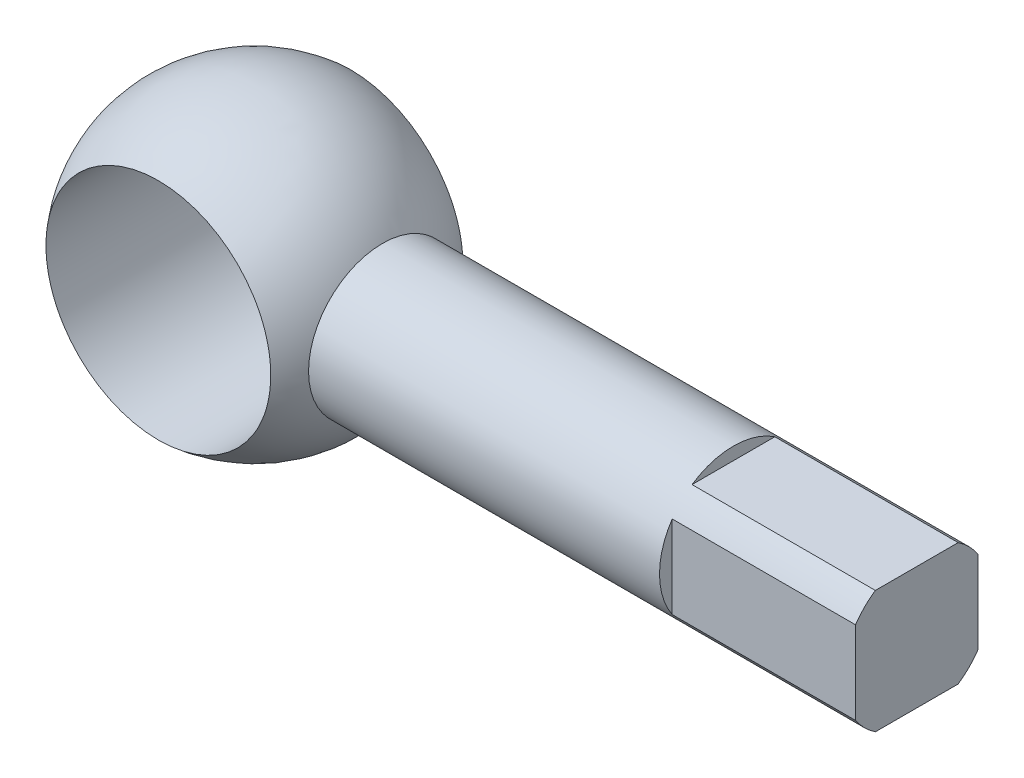
ISO-10303-21;
HEADER;
FILE_DESCRIPTION(('STEP AP214'),'2;1');
FILE_NAME('part.step','',(''),(''),'','','');
FILE_SCHEMA(('AUTOMOTIVE_DESIGN { 1 0 10303 214 1 1 1 1 }'));
ENDSEC;
DATA;
#1=APPLICATION_CONTEXT('core data for automotive mechanical design processes');
#2=APPLICATION_PROTOCOL_DEFINITION('international standard','automotive_design',2000,#1);
#3=PRODUCT_CONTEXT('',#1,'mechanical');
#4=PRODUCT('Part','Part','',(#3));
#5=PRODUCT_RELATED_PRODUCT_CATEGORY('part','',(#4));
#6=PRODUCT_DEFINITION_FORMATION('','',#4);
#7=PRODUCT_DEFINITION_CONTEXT('part definition',#1,'design');
#8=PRODUCT_DEFINITION('design','',#6,#7);
#9=PRODUCT_DEFINITION_SHAPE('','',#8);
#10=(LENGTH_UNIT() NAMED_UNIT(*) SI_UNIT(.MILLI.,.METRE.));
#11=(NAMED_UNIT(*) PLANE_ANGLE_UNIT() SI_UNIT($,.RADIAN.));
#12=(NAMED_UNIT(*) SI_UNIT($,.STERADIAN.) SOLID_ANGLE_UNIT());
#13=UNCERTAINTY_MEASURE_WITH_UNIT(LENGTH_MEASURE(1.E-05),#10,'distance_accuracy_value','');
#14=(GEOMETRIC_REPRESENTATION_CONTEXT(3) GLOBAL_UNCERTAINTY_ASSIGNED_CONTEXT((#13)) GLOBAL_UNIT_ASSIGNED_CONTEXT((#10,
#11,#12)) REPRESENTATION_CONTEXT('',''));
#15=CARTESIAN_POINT('',(0.,0.,0.));
#16=DIRECTION('',(0.,0.,1.));
#17=DIRECTION('',(1.,0.,0.));
#18=AXIS2_PLACEMENT_3D('',#15,#16,#17);
#19=CARTESIAN_POINT('',(-25.,0.,0.));
#20=DIRECTION('',(-1.,0.,0.));
#21=DIRECTION('',(0.,0.,1.));
#22=AXIS2_PLACEMENT_3D('',#19,#20,#21);
#23=CYLINDRICAL_SURFACE('',#22,12.5);
#24=CARTESIAN_POINT('',(21.650635094611,0.,0.));
#25=DIRECTION('',(-1.,0.,0.));
#26=DIRECTION('',(0.,0.,1.));
#27=AXIS2_PLACEMENT_3D('',#24,#25,#26);
#28=CIRCLE('',#27,12.5);
#29=CARTESIAN_POINT('',(21.650635094611,0.,12.5));
#30=VERTEX_POINT('',#29);
#31=EDGE_CURVE('E11',#30,#30,#28,.T.);
#32=ORIENTED_EDGE('',*,*,#31,.F.);
#33=EDGE_LOOP('',(#32));
#34=FACE_BOUND('',#33,.T.);
#35=DIRECTION('',(-1.,0.,0.));
#36=VECTOR('',#35,1.);
#37=CARTESIAN_POINT('',(411.706116100285,7.00000000000011,10.3561575886039));
#38=LINE('',#37,#36);
#39=CARTESIAN_POINT('',(112.,7.00000000000011,10.3561575886039));
#40=VERTEX_POINT('',#39);
#41=CARTESIAN_POINT('',(81.,7.0000000000001,10.3561575886039));
#42=VERTEX_POINT('',#41);
#43=EDGE_CURVE('E63',#40,#42,#38,.T.);
#44=ORIENTED_EDGE('',*,*,#43,.F.);
#45=CARTESIAN_POINT('',(112.,0.,0.));
#46=DIRECTION('',(-1.,0.,0.));
#47=DIRECTION('',(0.,0.,1.));
#48=AXIS2_PLACEMENT_3D('',#45,#46,#47);
#49=CIRCLE('',#48,12.5);
#50=CARTESIAN_POINT('',(112.,10.356157588604,7.));
#51=VERTEX_POINT('',#50);
#52=EDGE_CURVE('E131',#40,#51,#49,.T.);
#53=ORIENTED_EDGE('',*,*,#52,.T.);
#54=DIRECTION('',(-1.,0.,0.));
#55=VECTOR('',#54,1.);
#56=CARTESIAN_POINT('',(411.706116100285,10.356157588604,7.));
#57=LINE('',#56,#55);
#58=CARTESIAN_POINT('',(81.,10.356157588604,7.));
#59=VERTEX_POINT('',#58);
#60=EDGE_CURVE('E150',#51,#59,#57,.T.);
#61=ORIENTED_EDGE('',*,*,#60,.T.);
#62=CARTESIAN_POINT('',(81.,0.,0.));
#63=DIRECTION('',(-1.,0.,0.));
#64=DIRECTION('',(0.,0.,1.));
#65=AXIS2_PLACEMENT_3D('',#62,#63,#64);
#66=CIRCLE('',#65,12.5);
#67=CARTESIAN_POINT('',(81.,10.356157588604,-6.99999999999999));
#68=VERTEX_POINT('',#67);
#69=EDGE_CURVE('E145',#59,#68,#66,.T.);
#70=ORIENTED_EDGE('',*,*,#69,.T.);
#71=DIRECTION('',(-1.,0.,0.));
#72=VECTOR('',#71,1.);
#73=CARTESIAN_POINT('',(411.706116100285,10.356157588604,-7.));
#74=LINE('',#73,#72);
#75=CARTESIAN_POINT('',(112.,10.356157588604,-7.));
#76=VERTEX_POINT('',#75);
#77=EDGE_CURVE('E157',#76,#68,#74,.T.);
#78=ORIENTED_EDGE('',*,*,#77,.F.);
#79=CARTESIAN_POINT('',(112.,6.99999999999996,-10.356157588604));
#80=VERTEX_POINT('',#79);
#81=EDGE_CURVE('E55',#76,#80,#49,.T.);
#82=ORIENTED_EDGE('',*,*,#81,.T.);
#83=DIRECTION('',(-1.,0.,0.));
#84=VECTOR('',#83,1.);
#85=CARTESIAN_POINT('',(411.706116100285,6.99999999999996,-10.356157588604));
#86=LINE('',#85,#84);
#87=CARTESIAN_POINT('',(81.,6.99999999999996,-10.356157588604));
#88=VERTEX_POINT('',#87);
#89=EDGE_CURVE('E176',#80,#88,#86,.T.);
#90=ORIENTED_EDGE('',*,*,#89,.T.);
#91=CARTESIAN_POINT('',(81.,0.,0.));
#92=DIRECTION('',(-1.,0.,0.));
#93=DIRECTION('',(0.,0.,1.));
#94=AXIS2_PLACEMENT_3D('',#91,#92,#93);
#95=CIRCLE('',#94,12.5);
#96=CARTESIAN_POINT('',(81.,-7.00000000000003,-10.356157588604));
#97=VERTEX_POINT('',#96);
#98=EDGE_CURVE('E170',#88,#97,#95,.T.);
#99=ORIENTED_EDGE('',*,*,#98,.T.);
#100=DIRECTION('',(-1.,0.,0.));
#101=VECTOR('',#100,1.);
#102=CARTESIAN_POINT('',(411.706116100285,-7.00000000000004,-10.356157588604));
#103=LINE('',#102,#101);
#104=CARTESIAN_POINT('',(112.,-7.00000000000004,-10.356157588604));
#105=VERTEX_POINT('',#104);
#106=EDGE_CURVE('E180',#105,#97,#103,.T.);
#107=ORIENTED_EDGE('',*,*,#106,.F.);
#108=CARTESIAN_POINT('',(112.,-10.356157588604,-7.));
#109=VERTEX_POINT('',#108);
#110=EDGE_CURVE('E137',#105,#109,#49,.T.);
#111=ORIENTED_EDGE('',*,*,#110,.T.);
#112=DIRECTION('',(-1.,0.,0.));
#113=VECTOR('',#112,1.);
#114=CARTESIAN_POINT('',(411.706116100285,-10.356157588604,-7.));
#115=LINE('',#114,#113);
#116=CARTESIAN_POINT('',(81.,-10.356157588604,-7.));
#117=VERTEX_POINT('',#116);
#118=EDGE_CURVE('E175',#109,#117,#115,.T.);
#119=ORIENTED_EDGE('',*,*,#118,.T.);
#120=CARTESIAN_POINT('',(81.,0.,0.));
#121=DIRECTION('',(-1.,0.,0.));
#122=DIRECTION('',(0.,0.,1.));
#123=AXIS2_PLACEMENT_3D('',#120,#121,#122);
#124=CIRCLE('',#123,12.5);
#125=CARTESIAN_POINT('',(81.,-10.356157588604,6.99999999999999));
#126=VERTEX_POINT('',#125);
#127=EDGE_CURVE('E122',#117,#126,#124,.T.);
#128=ORIENTED_EDGE('',*,*,#127,.T.);
#129=DIRECTION('',(-1.,0.,0.));
#130=VECTOR('',#129,1.);
#131=CARTESIAN_POINT('',(411.706116100285,-10.356157588604,7.));
#132=LINE('',#131,#130);
#133=CARTESIAN_POINT('',(112.,-10.356157588604,7.));
#134=VERTEX_POINT('',#133);
#135=EDGE_CURVE('E71',#134,#126,#132,.T.);
#136=ORIENTED_EDGE('',*,*,#135,.F.);
#137=CARTESIAN_POINT('',(112.,-6.99999999999989,10.3561575886041));
#138=VERTEX_POINT('',#137);
#139=EDGE_CURVE('E129',#134,#138,#49,.T.);
#140=ORIENTED_EDGE('',*,*,#139,.T.);
#141=DIRECTION('',(-1.,0.,0.));
#142=VECTOR('',#141,1.);
#143=CARTESIAN_POINT('',(411.706116100285,-6.99999999999989,10.3561575886041));
#144=LINE('',#143,#142);
#145=CARTESIAN_POINT('',(81.,-6.99999999999989,10.3561575886041));
#146=VERTEX_POINT('',#145);
#147=EDGE_CURVE('E113',#138,#146,#144,.T.);
#148=ORIENTED_EDGE('',*,*,#147,.T.);
#149=CARTESIAN_POINT('',(81.,0.,0.));
#150=DIRECTION('',(-1.,0.,0.));
#151=DIRECTION('',(0.,0.,1.));
#152=AXIS2_PLACEMENT_3D('',#149,#150,#151);
#153=CIRCLE('',#152,12.5);
#154=EDGE_CURVE('E133',#146,#42,#153,.T.);
#155=ORIENTED_EDGE('',*,*,#154,.T.);
#156=EDGE_LOOP('',(#44,#53,#61,#70,#78,#82,#90,#99,#107,#111,#119,#128,#136,#140,#148,#155));
#157=FACE_BOUND('',#156,.T.);
#158=ADVANCED_FACE('F45',(#34,#157),#23,.T.);
#159=CARTESIAN_POINT('',(0.,0.,0.));
#160=DIRECTION('',(-1.,0.,0.));
#161=DIRECTION('',(0.,1.,0.));
#162=AXIS2_PLACEMENT_3D('',#159,#160,#161);
#163=SPHERICAL_SURFACE('',#162,25.);
#164=CARTESIAN_POINT('',(0.,0.,16.2480768092719));
#165=DIRECTION('',(0.,0.,-1.));
#166=DIRECTION('',(-1.,0.,0.));
#167=AXIS2_PLACEMENT_3D('',#164,#165,#166);
#168=CIRCLE('',#167,19.);
#169=CARTESIAN_POINT('',(-19.,0.,16.2480768092719));
#170=VERTEX_POINT('',#169);
#171=EDGE_CURVE('E49',#170,#170,#168,.T.);
#172=ORIENTED_EDGE('',*,*,#171,.T.);
#173=EDGE_LOOP('',(#172));
#174=FACE_BOUND('',#173,.T.);
#175=CARTESIAN_POINT('',(0.,0.,-16.2480768092719));
#176=DIRECTION('',(0.,0.,1.));
#177=DIRECTION('',(1.,0.,0.));
#178=AXIS2_PLACEMENT_3D('',#175,#176,#177);
#179=CIRCLE('',#178,19.);
#180=CARTESIAN_POINT('',(19.,0.,-16.2480768092719));
#181=VERTEX_POINT('',#180);
#182=EDGE_CURVE('E147',#181,#181,#179,.T.);
#183=ORIENTED_EDGE('',*,*,#182,.T.);
#184=EDGE_LOOP('',(#183));
#185=FACE_BOUND('',#184,.T.);
#186=ORIENTED_EDGE('',*,*,#31,.T.);
#187=EDGE_LOOP('',(#186));
#188=FACE_BOUND('',#187,.T.);
#189=ADVANCED_FACE('F47',(#174,#185,#188),#163,.T.);
#190=CARTESIAN_POINT('',(112.,12.5,0.));
#191=DIRECTION('',(-1.,0.,0.));
#192=DIRECTION('',(0.,0.,1.));
#193=AXIS2_PLACEMENT_3D('',#190,#191,#192);
#194=PLANE('',#193);
#195=ORIENTED_EDGE('',*,*,#52,.F.);
#196=DIRECTION('',(0.,-1.,0.));
#197=VECTOR('',#196,1.);
#198=CARTESIAN_POINT('',(112.,-6.99999999999989,10.3561575886041));
#199=LINE('',#198,#197);
#200=EDGE_CURVE('E116',#40,#138,#199,.T.);
#201=ORIENTED_EDGE('',*,*,#200,.T.);
#202=ORIENTED_EDGE('',*,*,#139,.F.);
#203=DIRECTION('',(0.,0.,-1.));
#204=VECTOR('',#203,1.);
#205=CARTESIAN_POINT('',(112.,-10.356157588604,-7.));
#206=LINE('',#205,#204);
#207=EDGE_CURVE('E192',#134,#109,#206,.T.);
#208=ORIENTED_EDGE('',*,*,#207,.T.);
#209=ORIENTED_EDGE('',*,*,#110,.F.);
#210=DIRECTION('',(0.,1.,0.));
#211=VECTOR('',#210,1.);
#212=CARTESIAN_POINT('',(112.,6.99999999999996,-10.356157588604));
#213=LINE('',#212,#211);
#214=EDGE_CURVE('E174',#105,#80,#213,.T.);
#215=ORIENTED_EDGE('',*,*,#214,.T.);
#216=ORIENTED_EDGE('',*,*,#81,.F.);
#217=DIRECTION('',(0.,0.,1.));
#218=VECTOR('',#217,1.);
#219=CARTESIAN_POINT('',(112.,10.356157588604,7.));
#220=LINE('',#219,#218);
#221=EDGE_CURVE('E164',#76,#51,#220,.T.);
#222=ORIENTED_EDGE('',*,*,#221,.T.);
#223=EDGE_LOOP('',(#195,#201,#202,#208,#209,#215,#216,#222));
#224=FACE_BOUND('',#223,.T.);
#225=ADVANCED_FACE('F127',(#224),#194,.F.);
#226=CARTESIAN_POINT('',(0.,0.,-25.));
#227=DIRECTION('',(0.,0.,1.));
#228=DIRECTION('',(1.,0.,0.));
#229=AXIS2_PLACEMENT_3D('',#226,#227,#228);
#230=CYLINDRICAL_SURFACE('',#229,19.);
#231=ORIENTED_EDGE('',*,*,#182,.F.);
#232=EDGE_LOOP('',(#231));
#233=FACE_BOUND('',#232,.T.);
#234=ORIENTED_EDGE('',*,*,#171,.F.);
#235=EDGE_LOOP('',(#234));
#236=FACE_BOUND('',#235,.T.);
#237=ADVANCED_FACE('F245',(#233,#236),#230,.F.);
#238=CARTESIAN_POINT('',(411.706116100285,10.356157588604,7.));
#239=DIRECTION('',(0.,1.,0.));
#240=DIRECTION('',(0.,0.,1.));
#241=AXIS2_PLACEMENT_3D('',#238,#239,#240);
#242=PLANE('',#241);
#243=ORIENTED_EDGE('',*,*,#221,.F.);
#244=ORIENTED_EDGE('',*,*,#77,.T.);
#245=DIRECTION('',(0.,0.,1.));
#246=VECTOR('',#245,1.);
#247=CARTESIAN_POINT('',(81.,10.356157588604,7.));
#248=LINE('',#247,#246);
#249=EDGE_CURVE('E161',#68,#59,#248,.T.);
#250=ORIENTED_EDGE('',*,*,#249,.T.);
#251=ORIENTED_EDGE('',*,*,#60,.F.);
#252=EDGE_LOOP('',(#243,#244,#250,#251));
#253=FACE_BOUND('',#252,.T.);
#254=ADVANCED_FACE('F215',(#253),#242,.T.);
#255=CARTESIAN_POINT('',(81.,12.5,0.));
#256=DIRECTION('',(-1.,0.,0.));
#257=DIRECTION('',(0.,0.,1.));
#258=AXIS2_PLACEMENT_3D('',#255,#256,#257);
#259=PLANE('',#258);
#260=ORIENTED_EDGE('',*,*,#69,.F.);
#261=ORIENTED_EDGE('',*,*,#249,.F.);
#262=EDGE_LOOP('',(#260,#261));
#263=FACE_BOUND('',#262,.T.);
#264=ADVANCED_FACE('F213',(#263),#259,.F.);
#265=CARTESIAN_POINT('',(411.706116100285,6.99999999999996,-10.356157588604));
#266=DIRECTION('',(0.,0.,-1.));
#267=DIRECTION('',(0.,1.,0.));
#268=AXIS2_PLACEMENT_3D('',#265,#266,#267);
#269=PLANE('',#268);
#270=ORIENTED_EDGE('',*,*,#214,.F.);
#271=ORIENTED_EDGE('',*,*,#106,.T.);
#272=DIRECTION('',(0.,1.,0.));
#273=VECTOR('',#272,1.);
#274=CARTESIAN_POINT('',(81.,6.99999999999996,-10.356157588604));
#275=LINE('',#274,#273);
#276=EDGE_CURVE('E183',#97,#88,#275,.T.);
#277=ORIENTED_EDGE('',*,*,#276,.T.);
#278=ORIENTED_EDGE('',*,*,#89,.F.);
#279=EDGE_LOOP('',(#270,#271,#277,#278));
#280=FACE_BOUND('',#279,.T.);
#281=ADVANCED_FACE('F219',(#280),#269,.T.);
#282=CARTESIAN_POINT('',(81.,12.5,0.));
#283=DIRECTION('',(-1.,0.,0.));
#284=DIRECTION('',(0.,0.,1.));
#285=AXIS2_PLACEMENT_3D('',#282,#283,#284);
#286=PLANE('',#285);
#287=ORIENTED_EDGE('',*,*,#98,.F.);
#288=ORIENTED_EDGE('',*,*,#276,.F.);
#289=EDGE_LOOP('',(#287,#288));
#290=FACE_BOUND('',#289,.T.);
#291=ADVANCED_FACE('F222',(#290),#286,.F.);
#292=CARTESIAN_POINT('',(411.706116100285,-10.356157588604,-7.));
#293=DIRECTION('',(0.,-1.,0.));
#294=DIRECTION('',(0.,0.,-1.));
#295=AXIS2_PLACEMENT_3D('',#292,#293,#294);
#296=PLANE('',#295);
#297=ORIENTED_EDGE('',*,*,#207,.F.);
#298=ORIENTED_EDGE('',*,*,#135,.T.);
#299=DIRECTION('',(0.,0.,-1.));
#300=VECTOR('',#299,1.);
#301=CARTESIAN_POINT('',(81.,-10.356157588604,-7.));
#302=LINE('',#301,#300);
#303=EDGE_CURVE('E198',#126,#117,#302,.T.);
#304=ORIENTED_EDGE('',*,*,#303,.T.);
#305=ORIENTED_EDGE('',*,*,#118,.F.);
#306=EDGE_LOOP('',(#297,#298,#304,#305));
#307=FACE_BOUND('',#306,.T.);
#308=ADVANCED_FACE('F224',(#307),#296,.T.);
#309=CARTESIAN_POINT('',(81.,12.5,0.));
#310=DIRECTION('',(-1.,0.,0.));
#311=DIRECTION('',(0.,0.,1.));
#312=AXIS2_PLACEMENT_3D('',#309,#310,#311);
#313=PLANE('',#312);
#314=ORIENTED_EDGE('',*,*,#127,.F.);
#315=ORIENTED_EDGE('',*,*,#303,.F.);
#316=EDGE_LOOP('',(#314,#315));
#317=FACE_BOUND('',#316,.T.);
#318=ADVANCED_FACE('F230',(#317),#313,.F.);
#319=CARTESIAN_POINT('',(411.706116100285,-6.99999999999989,10.3561575886041));
#320=DIRECTION('',(0.,0.,1.));
#321=DIRECTION('',(0.,-1.,0.));
#322=AXIS2_PLACEMENT_3D('',#319,#320,#321);
#323=PLANE('',#322);
#324=ORIENTED_EDGE('',*,*,#200,.F.);
#325=ORIENTED_EDGE('',*,*,#43,.T.);
#326=DIRECTION('',(0.,-1.,0.));
#327=VECTOR('',#326,1.);
#328=CARTESIAN_POINT('',(81.,-6.99999999999989,10.3561575886041));
#329=LINE('',#328,#327);
#330=EDGE_CURVE('E117',#42,#146,#329,.T.);
#331=ORIENTED_EDGE('',*,*,#330,.T.);
#332=ORIENTED_EDGE('',*,*,#147,.F.);
#333=EDGE_LOOP('',(#324,#325,#331,#332));
#334=FACE_BOUND('',#333,.T.);
#335=ADVANCED_FACE('F115',(#334),#323,.T.);
#336=CARTESIAN_POINT('',(81.,12.5,0.));
#337=DIRECTION('',(-1.,0.,0.));
#338=DIRECTION('',(0.,0.,1.));
#339=AXIS2_PLACEMENT_3D('',#336,#337,#338);
#340=PLANE('',#339);
#341=ORIENTED_EDGE('',*,*,#154,.F.);
#342=ORIENTED_EDGE('',*,*,#330,.F.);
#343=EDGE_LOOP('',(#341,#342));
#344=FACE_BOUND('',#343,.T.);
#345=ADVANCED_FACE('F298',(#344),#340,.F.);
#346=CLOSED_SHELL('',(#158,#189,#225,#237,#254,#264,#281,#291,#308,#318,#335,#345));
#347=MANIFOLD_SOLID_BREP('B2',#346);
#348=ADVANCED_BREP_SHAPE_REPRESENTATION('',(#18,#347),#14);
#349=SHAPE_DEFINITION_REPRESENTATION(#9,#348);
ENDSEC;
END-ISO-10303-21;
